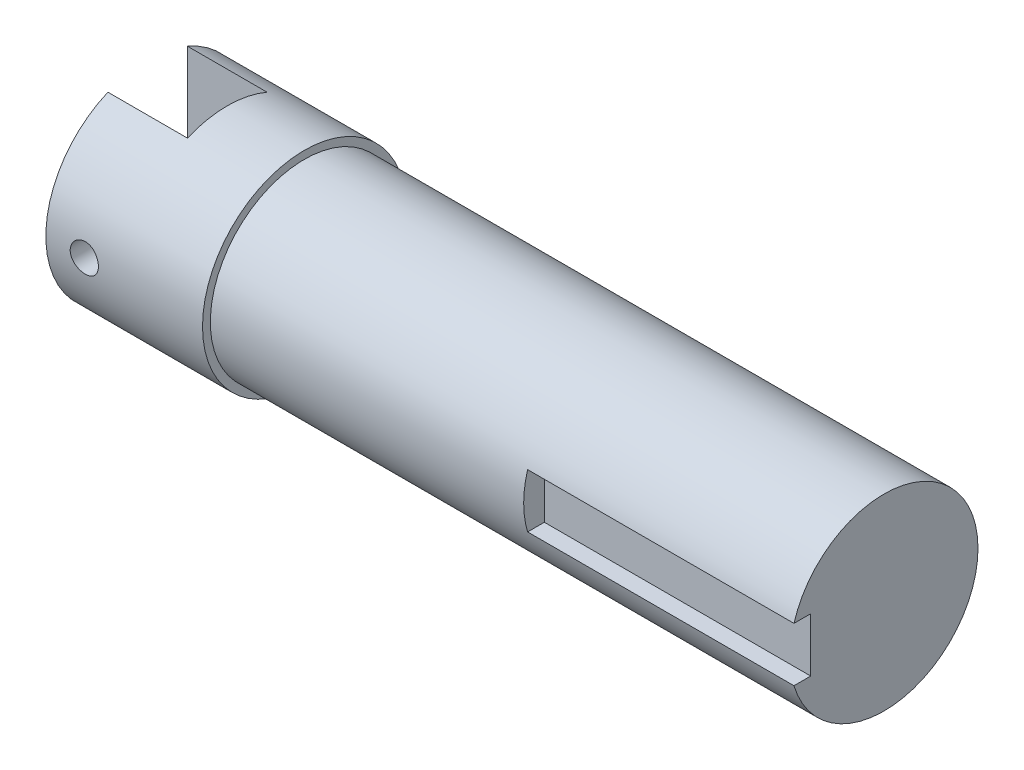
ISO-10303-21;
HEADER;
FILE_DESCRIPTION(('STEP AP214'),'2;1');
FILE_NAME('part.step','',(''),(''),'','','');
FILE_SCHEMA(('AUTOMOTIVE_DESIGN { 1 0 10303 214 1 1 1 1 }'));
ENDSEC;
DATA;
#1=APPLICATION_CONTEXT('core data for automotive mechanical design processes');
#2=APPLICATION_PROTOCOL_DEFINITION('international standard','automotive_design',2000,#1);
#3=PRODUCT_CONTEXT('',#1,'mechanical');
#4=PRODUCT('Part','Part','',(#3));
#5=PRODUCT_RELATED_PRODUCT_CATEGORY('part','',(#4));
#6=PRODUCT_DEFINITION_FORMATION('','',#4);
#7=PRODUCT_DEFINITION_CONTEXT('part definition',#1,'design');
#8=PRODUCT_DEFINITION('design','',#6,#7);
#9=PRODUCT_DEFINITION_SHAPE('','',#8);
#10=(LENGTH_UNIT() NAMED_UNIT(*) SI_UNIT(.MILLI.,.METRE.));
#11=(NAMED_UNIT(*) PLANE_ANGLE_UNIT() SI_UNIT($,.RADIAN.));
#12=(NAMED_UNIT(*) SI_UNIT($,.STERADIAN.) SOLID_ANGLE_UNIT());
#13=UNCERTAINTY_MEASURE_WITH_UNIT(LENGTH_MEASURE(1.E-05),#10,'distance_accuracy_value','');
#14=(GEOMETRIC_REPRESENTATION_CONTEXT(3) GLOBAL_UNCERTAINTY_ASSIGNED_CONTEXT((#13)) GLOBAL_UNIT_ASSIGNED_CONTEXT((#10,
#11,#12)) REPRESENTATION_CONTEXT('',''));
#15=CARTESIAN_POINT('',(0.,0.,0.));
#16=DIRECTION('',(0.,0.,1.));
#17=DIRECTION('',(1.,0.,0.));
#18=AXIS2_PLACEMENT_3D('',#15,#16,#17);
#19=CARTESIAN_POINT('',(-50.,0.,0.));
#20=DIRECTION('',(1.,0.,0.));
#21=DIRECTION('',(0.,0.,-1.));
#22=AXIS2_PLACEMENT_3D('',#19,#20,#21);
#23=CYLINDRICAL_SURFACE('',#22,32.5);
#24=CARTESIAN_POINT('',(0.,0.,0.));
#25=DIRECTION('',(-1.,0.,0.));
#26=DIRECTION('',(0.,0.,1.));
#27=AXIS2_PLACEMENT_3D('',#24,#25,#26);
#28=CIRCLE('',#27,32.5);
#29=CARTESIAN_POINT('',(0.,0.,32.5));
#30=VERTEX_POINT('',#29);
#31=EDGE_CURVE('E133',#30,#30,#28,.T.);
#32=ORIENTED_EDGE('',*,*,#31,.T.);
#33=EDGE_LOOP('',(#32));
#34=FACE_BOUND('',#33,.T.);
#35=DIRECTION('',(1.,0.,0.));
#36=VECTOR('',#35,1.);
#37=CARTESIAN_POINT('',(-50.,29.915882069563,12.7));
#38=LINE('',#37,#36);
#39=CARTESIAN_POINT('',(-50.,29.915882069563,12.7));
#40=VERTEX_POINT('',#39);
#41=CARTESIAN_POINT('',(-24.6,29.915882069563,12.7));
#42=VERTEX_POINT('',#41);
#43=EDGE_CURVE('E155',#40,#42,#38,.T.);
#44=ORIENTED_EDGE('',*,*,#43,.F.);
#45=CARTESIAN_POINT('',(-50.,0.,0.));
#46=DIRECTION('',(-1.,0.,0.));
#47=DIRECTION('',(0.,0.,1.));
#48=AXIS2_PLACEMENT_3D('',#45,#46,#47);
#49=CIRCLE('',#48,32.5);
#50=CARTESIAN_POINT('',(-50.,-29.915882069563,12.7));
#51=VERTEX_POINT('',#50);
#52=EDGE_CURVE('E127',#51,#40,#49,.T.);
#53=ORIENTED_EDGE('',*,*,#52,.F.);
#54=DIRECTION('',(1.,0.,0.));
#55=VECTOR('',#54,1.);
#56=CARTESIAN_POINT('',(-50.,-29.915882069563,12.7));
#57=LINE('',#56,#55);
#58=CARTESIAN_POINT('',(-24.6,-29.915882069563,12.7));
#59=VERTEX_POINT('',#58);
#60=EDGE_CURVE('E154',#59,#51,#57,.F.);
#61=ORIENTED_EDGE('',*,*,#60,.F.);
#62=CARTESIAN_POINT('',(-24.6,0.,0.));
#63=DIRECTION('',(-1.,0.,0.));
#64=DIRECTION('',(0.,0.,1.));
#65=AXIS2_PLACEMENT_3D('',#62,#63,#64);
#66=CIRCLE('',#65,32.5);
#67=CARTESIAN_POINT('',(-24.6,-29.915882069563,-12.7));
#68=VERTEX_POINT('',#67);
#69=EDGE_CURVE('E50',#68,#59,#66,.T.);
#70=ORIENTED_EDGE('',*,*,#69,.F.);
#71=DIRECTION('',(1.,0.,0.));
#72=VECTOR('',#71,1.);
#73=CARTESIAN_POINT('',(-50.,-29.915882069563,-12.7));
#74=LINE('',#73,#72);
#75=CARTESIAN_POINT('',(-50.,-29.915882069563,-12.7));
#76=VERTEX_POINT('',#75);
#77=EDGE_CURVE('E109',#68,#76,#74,.F.);
#78=ORIENTED_EDGE('',*,*,#77,.T.);
#79=CARTESIAN_POINT('',(-50.,29.915882069563,-12.7));
#80=VERTEX_POINT('',#79);
#81=EDGE_CURVE('E121',#80,#76,#49,.T.);
#82=ORIENTED_EDGE('',*,*,#81,.F.);
#83=DIRECTION('',(1.,0.,0.));
#84=VECTOR('',#83,1.);
#85=CARTESIAN_POINT('',(-50.,29.915882069563,-12.7));
#86=LINE('',#85,#84);
#87=CARTESIAN_POINT('',(-24.6,29.915882069563,-12.7));
#88=VERTEX_POINT('',#87);
#89=EDGE_CURVE('E57',#80,#88,#86,.T.);
#90=ORIENTED_EDGE('',*,*,#89,.T.);
#91=EDGE_CURVE('E11',#42,#88,#66,.T.);
#92=ORIENTED_EDGE('',*,*,#91,.F.);
#93=EDGE_LOOP('',(#44,#53,#61,#70,#78,#82,#90,#92));
#94=FACE_BOUND('',#93,.T.);
#95=CARTESIAN_POINT('',(-42.2297556983694,0.,32.5));
#96=CARTESIAN_POINT('',(-42.2297451677036,-0.251476713775578,32.4999961967984));
#97=CARTESIAN_POINT('',(-42.2086043939546,-0.50310478940474,32.4970505017367));
#98=CARTESIAN_POINT('',(-42.1246126299622,-0.999342758172016,32.4855829606299));
#99=CARTESIAN_POINT('',(-42.0617196039774,-1.2439453189056,32.4770554950366));
#100=CARTESIAN_POINT('',(-41.8961257537616,-1.71887765065578,32.4553838558711));
#101=CARTESIAN_POINT('',(-41.7934534322544,-1.94921750446027,32.4422429885323));
#102=CARTESIAN_POINT('',(-41.551281715441,-2.38935903564809,32.4128011760166));
#103=CARTESIAN_POINT('',(-41.4117880134298,-2.59916388127082,32.3965007194765));
#104=CARTESIAN_POINT('',(-41.0989361055868,-2.99372458135041,32.3624338055038));
#105=CARTESIAN_POINT('',(-40.9253801831463,-3.17832297301913,32.34465915659));
#106=CARTESIAN_POINT('',(-40.5497555990823,-3.51587326350804,32.3097122100158));
#107=CARTESIAN_POINT('',(-40.3476853918274,-3.66882344571174,32.2925399450709));
#108=CARTESIAN_POINT('',(-39.9197263672851,-3.9393363293882,32.2606621888148));
#109=CARTESIAN_POINT('',(-39.6937418159321,-4.05674893091849,32.2459672736233));
#110=CARTESIAN_POINT('',(-39.2250236093747,-4.25189485531683,32.2208182714461));
#111=CARTESIAN_POINT('',(-38.9822907321945,-4.32963001994773,32.2103639876219));
#112=CARTESIAN_POINT('',(-38.4886125042317,-4.44273029607437,32.1949595049808));
#113=CARTESIAN_POINT('',(-38.2377296385564,-4.47836332950903,32.1899745163225));
#114=CARTESIAN_POINT('',(-37.7334994758609,-4.5070773930153,32.1859670703542));
#115=CARTESIAN_POINT('',(-37.4801523003613,-4.50016051080444,32.186944320506));
#116=CARTESIAN_POINT('',(-36.9800653733341,-4.44419050668617,32.1947191037414));
#117=CARTESIAN_POINT('',(-36.7332916745216,-4.39543419051841,32.2014756379387));
#118=CARTESIAN_POINT('',(-36.2514622501809,-4.25763321097773,32.2199837109791));
#119=CARTESIAN_POINT('',(-36.0164068111022,-4.16858756327952,32.2317353718596));
#120=CARTESIAN_POINT('',(-35.5637740311881,-3.95242192943067,32.258955464481));
#121=CARTESIAN_POINT('',(-35.3462582569872,-3.82517465201875,32.274436287503));
#122=CARTESIAN_POINT('',(-34.9355545139508,-3.53630868635925,32.3073611719864));
#123=CARTESIAN_POINT('',(-34.7423679093103,-3.37468807208104,32.3248053434336));
#124=CARTESIAN_POINT('',(-34.3840849204299,-3.02002643822979,32.3598731155141));
#125=CARTESIAN_POINT('',(-34.2192413761775,-2.82672991685896,32.377496980523));
#126=CARTESIAN_POINT('',(-33.9242981803474,-2.41507855285903,32.4108001416562));
#127=CARTESIAN_POINT('',(-33.7941986430385,-2.19672362781936,32.4264794313849));
#128=CARTESIAN_POINT('',(-33.5724297309782,-1.7409462909971,32.454139828637));
#129=CARTESIAN_POINT('',(-33.4807780842477,-1.50351514330564,32.4661192295007));
#130=CARTESIAN_POINT('',(-33.3387171528008,-1.01642945157678,32.4850153198952));
#131=CARTESIAN_POINT('',(-33.2883054956737,-0.766775611549387,32.4919323006493));
#132=CARTESIAN_POINT('',(-33.2304876344266,-0.264515392173606,32.4998859786858));
#133=CARTESIAN_POINT('',(-33.2227334939367,-0.0119497903126556,32.5009702489016));
#134=CARTESIAN_POINT('',(-33.2495298205025,0.490877663116604,32.4972653278649));
#135=CARTESIAN_POINT('',(-33.2840791766062,0.741139575009299,32.492476290854));
#136=CARTESIAN_POINT('',(-33.3942125537434,1.23121489955244,32.4775923445856));
#137=CARTESIAN_POINT('',(-33.4696288059083,1.47106672978644,32.4675191335522));
#138=CARTESIAN_POINT('',(-33.6591794744278,1.9347203432569,32.4431934987228));
#139=CARTESIAN_POINT('',(-33.7733154709711,2.15852147099768,32.4289409043654));
#140=CARTESIAN_POINT('',(-34.0378943302182,2.58526237363048,32.3977242682124));
#141=CARTESIAN_POINT('',(-34.1885600150641,2.78806277681038,32.3807438102731));
#142=CARTESIAN_POINT('',(-34.5216087771067,3.16562300652935,32.3460174684232));
#143=CARTESIAN_POINT('',(-34.7039934123805,3.34038145479911,32.3282715469443));
#144=CARTESIAN_POINT('',(-35.0968440652709,3.6581478575641,32.2938654474841));
#145=CARTESIAN_POINT('',(-35.3074986019274,3.80092380777263,32.2772137856068));
#146=CARTESIAN_POINT('',(-35.7500037230946,4.04906448092933,32.2470272710179));
#147=CARTESIAN_POINT('',(-35.981853803799,4.15443009281,32.2334923442501));
#148=CARTESIAN_POINT('',(-36.4594494351649,4.32439176902625,32.2111317882919));
#149=CARTESIAN_POINT('',(-36.7051493298058,4.38911412693432,32.2022915842129));
#150=CARTESIAN_POINT('',(-37.2040616468359,4.47635645326582,32.1902812136673));
#151=CARTESIAN_POINT('',(-37.4572736323055,4.49887887126019,32.1871107180928));
#152=CARTESIAN_POINT('',(-37.9617121732623,4.50103014338553,32.1868097608989));
#153=CARTESIAN_POINT('',(-38.2129372200853,4.48102361290709,32.189627956089));
#154=CARTESIAN_POINT('',(-38.7084151715534,4.39946178518042,32.2008758407262));
#155=CARTESIAN_POINT('',(-38.9526680811706,4.33790651756229,32.2093055261716));
#156=CARTESIAN_POINT('',(-39.4271927753685,4.17511639123033,32.2308096274505));
#157=CARTESIAN_POINT('',(-39.6574721228238,4.07390322170887,32.2438815040708));
#158=CARTESIAN_POINT('',(-40.0978390927872,3.83470625888075,32.2732007003367));
#159=CARTESIAN_POINT('',(-40.3079262376124,3.69672159596941,32.2894480950772));
#160=CARTESIAN_POINT('',(-40.703803558774,3.38655978128656,32.323454064158));
#161=CARTESIAN_POINT('',(-40.8893804723867,3.21411164277081,32.3412239332684));
#162=CARTESIAN_POINT('',(-41.2290957062609,2.84048892484938,32.3761756740433));
#163=CARTESIAN_POINT('',(-41.3832266632331,2.63930763608215,32.3933574072095));
#164=CARTESIAN_POINT('',(-41.6563042237974,2.21283684805816,32.4252872449895));
#165=CARTESIAN_POINT('',(-41.7750834277696,1.98743931655715,32.4400236291611));
#166=CARTESIAN_POINT('',(-41.9729275895558,1.51980664796643,32.4652860630007));
#167=CARTESIAN_POINT('',(-42.0520346619281,1.27758967821949,32.4758165750478));
#168=CARTESIAN_POINT('',(-42.1498611194011,0.861835746844076,32.489011430211));
#169=CARTESIAN_POINT('',(-42.1797771351664,0.690893363532976,32.4931115113834));
#170=CARTESIAN_POINT('',(-42.2197279568701,0.346657949921302,32.4986070939359));
#171=CARTESIAN_POINT('',(-42.2297629580804,0.173364942725462,32.5000026218803));
#172=CARTESIAN_POINT('',(-42.2297556983694,0.,32.5));
#173=B_SPLINE_CURVE_WITH_KNOTS('',3,(#95,#96,#97,#98,#99,#100,#101,#102,#103,#104,#105,#106,
#107,#108,#109,#110,#111,#112,#113,#114,#115,#116,#117,#118,#119,#120,#121,#122,#123,#124,#125,
#126,#127,#128,#129,#130,#131,#132,#133,#134,#135,#136,#137,#138,#139,#140,#141,#142,#143,#144,
#145,#146,#147,#148,#149,#150,#151,#152,#153,#154,#155,#156,#157,#158,#159,#160,#161,#162,#163,
#164,#165,#166,#167,#168,#169,#170,#171,#172),.UNSPECIFIED.,.T.,.F.,(4,2,2,2,2,2,2,2,2,2,2,2,2,
2,2,2,2,2,2,2,2,2,2,2,2,2,2,2,2,2,2,2,2,2,2,2,2,2,4),(0.,0.753796769010256,1.50835360619536,
2.2623707840264,3.01627144448885,3.77468500241174,4.53313968633046,5.29475453026309,
6.05633401804302,6.81304054510393,7.5697099445499,8.32105554826591,9.0724195094075,
9.82631540716196,10.5802535588686,11.3406029574705,12.1009548567352,12.8616569639685,
13.6223153072524,14.3767600322741,15.1311849448957,15.8825359613667,16.6339176448591,
17.3900032766185,18.1461260588065,18.9075679559686,19.6689917587806,20.4280376745418,
21.1870395287609,21.9395604543382,22.6920808432625,23.4441902465277,24.1963174379175,
24.9546093969473,25.7130787120364,26.4750844303599,27.2362795084214,27.7559428017142,
28.2756009908328),.UNSPECIFIED.);
#174=CARTESIAN_POINT('',(-42.2297556983694,0.,32.5));
#175=VERTEX_POINT('',#174);
#176=EDGE_CURVE('E224',#175,#175,#173,.T.);
#177=ORIENTED_EDGE('',*,*,#176,.F.);
#178=EDGE_LOOP('',(#177));
#179=FACE_BOUND('',#178,.T.);
#180=CARTESIAN_POINT('',(-42.2297556983694,0.,-32.5));
#181=CARTESIAN_POINT('',(-42.2297451677036,0.251476713775578,-32.4999961967984));
#182=CARTESIAN_POINT('',(-42.2086043939546,0.50310478940474,-32.4970505017367));
#183=CARTESIAN_POINT('',(-42.1246126299622,0.999342758172016,-32.4855829606299));
#184=CARTESIAN_POINT('',(-42.0617196039774,1.2439453189056,-32.4770554950366));
#185=CARTESIAN_POINT('',(-41.8961257537616,1.71887765065578,-32.4553838558711));
#186=CARTESIAN_POINT('',(-41.7934534322544,1.94921750446027,-32.4422429885323));
#187=CARTESIAN_POINT('',(-41.551281715441,2.38935903564809,-32.4128011760166));
#188=CARTESIAN_POINT('',(-41.4117880134298,2.59916388127082,-32.3965007194765));
#189=CARTESIAN_POINT('',(-41.0989361055868,2.99372458135041,-32.3624338055038));
#190=CARTESIAN_POINT('',(-40.9253801831463,3.17832297301913,-32.34465915659));
#191=CARTESIAN_POINT('',(-40.5497555990823,3.51587326350804,-32.3097122100158));
#192=CARTESIAN_POINT('',(-40.3476853918274,3.66882344571174,-32.2925399450709));
#193=CARTESIAN_POINT('',(-39.9197263672851,3.9393363293882,-32.2606621888148));
#194=CARTESIAN_POINT('',(-39.6937418159321,4.05674893091849,-32.2459672736233));
#195=CARTESIAN_POINT('',(-39.2250236093747,4.25189485531683,-32.2208182714461));
#196=CARTESIAN_POINT('',(-38.9822907321945,4.32963001994773,-32.2103639876219));
#197=CARTESIAN_POINT('',(-38.4886125042317,4.44273029607437,-32.1949595049808));
#198=CARTESIAN_POINT('',(-38.2377296385564,4.47836332950903,-32.1899745163225));
#199=CARTESIAN_POINT('',(-37.7334994758609,4.5070773930153,-32.1859670703542));
#200=CARTESIAN_POINT('',(-37.4801523003613,4.50016051080444,-32.186944320506));
#201=CARTESIAN_POINT('',(-36.9800653733341,4.44419050668617,-32.1947191037414));
#202=CARTESIAN_POINT('',(-36.7332916745216,4.39543419051841,-32.2014756379387));
#203=CARTESIAN_POINT('',(-36.2514622501809,4.25763321097773,-32.2199837109791));
#204=CARTESIAN_POINT('',(-36.0164068111022,4.16858756327952,-32.2317353718596));
#205=CARTESIAN_POINT('',(-35.5637740311881,3.95242192943067,-32.258955464481));
#206=CARTESIAN_POINT('',(-35.3462582569872,3.82517465201875,-32.274436287503));
#207=CARTESIAN_POINT('',(-34.9355545139508,3.53630868635925,-32.3073611719864));
#208=CARTESIAN_POINT('',(-34.7423679093103,3.37468807208104,-32.3248053434336));
#209=CARTESIAN_POINT('',(-34.3840849204299,3.02002643822979,-32.3598731155141));
#210=CARTESIAN_POINT('',(-34.2192413761775,2.82672991685896,-32.377496980523));
#211=CARTESIAN_POINT('',(-33.9242981803474,2.41507855285903,-32.4108001416562));
#212=CARTESIAN_POINT('',(-33.7941986430385,2.19672362781936,-32.4264794313849));
#213=CARTESIAN_POINT('',(-33.5724297309782,1.7409462909971,-32.454139828637));
#214=CARTESIAN_POINT('',(-33.4807780842477,1.50351514330564,-32.4661192295007));
#215=CARTESIAN_POINT('',(-33.3387171528008,1.01642945157678,-32.4850153198952));
#216=CARTESIAN_POINT('',(-33.2883054956737,0.766775611549387,-32.4919323006493));
#217=CARTESIAN_POINT('',(-33.2304876344266,0.264515392173606,-32.4998859786858));
#218=CARTESIAN_POINT('',(-33.2227334939367,0.0119497903126556,-32.5009702489016));
#219=CARTESIAN_POINT('',(-33.2495298205025,-0.490877663116604,-32.4972653278649));
#220=CARTESIAN_POINT('',(-33.2840791766062,-0.741139575009299,-32.492476290854));
#221=CARTESIAN_POINT('',(-33.3942125537434,-1.23121489955244,-32.4775923445856));
#222=CARTESIAN_POINT('',(-33.4696288059083,-1.47106672978644,-32.4675191335522));
#223=CARTESIAN_POINT('',(-33.6591794744278,-1.9347203432569,-32.4431934987228));
#224=CARTESIAN_POINT('',(-33.7733154709711,-2.15852147099768,-32.4289409043654));
#225=CARTESIAN_POINT('',(-34.0378943302182,-2.58526237363048,-32.3977242682124));
#226=CARTESIAN_POINT('',(-34.1885600150641,-2.78806277681038,-32.3807438102731));
#227=CARTESIAN_POINT('',(-34.5216087771067,-3.16562300652935,-32.3460174684232));
#228=CARTESIAN_POINT('',(-34.7039934123805,-3.34038145479911,-32.3282715469443));
#229=CARTESIAN_POINT('',(-35.0968440652709,-3.6581478575641,-32.2938654474841));
#230=CARTESIAN_POINT('',(-35.3074986019274,-3.80092380777263,-32.2772137856068));
#231=CARTESIAN_POINT('',(-35.7500037230946,-4.04906448092933,-32.2470272710179));
#232=CARTESIAN_POINT('',(-35.981853803799,-4.15443009281,-32.2334923442501));
#233=CARTESIAN_POINT('',(-36.4594494351649,-4.32439176902625,-32.2111317882919));
#234=CARTESIAN_POINT('',(-36.7051493298058,-4.38911412693432,-32.2022915842129));
#235=CARTESIAN_POINT('',(-37.2040616468359,-4.47635645326582,-32.1902812136673));
#236=CARTESIAN_POINT('',(-37.4572736323055,-4.49887887126019,-32.1871107180928));
#237=CARTESIAN_POINT('',(-37.9617121732623,-4.50103014338553,-32.1868097608989));
#238=CARTESIAN_POINT('',(-38.2129372200853,-4.48102361290709,-32.189627956089));
#239=CARTESIAN_POINT('',(-38.7084151715534,-4.39946178518042,-32.2008758407262));
#240=CARTESIAN_POINT('',(-38.9526680811706,-4.33790651756229,-32.2093055261716));
#241=CARTESIAN_POINT('',(-39.4271927753685,-4.17511639123033,-32.2308096274505));
#242=CARTESIAN_POINT('',(-39.6574721228238,-4.07390322170887,-32.2438815040708));
#243=CARTESIAN_POINT('',(-40.0978390927872,-3.83470625888075,-32.2732007003367));
#244=CARTESIAN_POINT('',(-40.3079262376124,-3.69672159596941,-32.2894480950772));
#245=CARTESIAN_POINT('',(-40.703803558774,-3.38655978128656,-32.323454064158));
#246=CARTESIAN_POINT('',(-40.8893804723867,-3.21411164277081,-32.3412239332684));
#247=CARTESIAN_POINT('',(-41.2290957062609,-2.84048892484938,-32.3761756740433));
#248=CARTESIAN_POINT('',(-41.3832266632331,-2.63930763608215,-32.3933574072095));
#249=CARTESIAN_POINT('',(-41.6563042237974,-2.21283684805816,-32.4252872449895));
#250=CARTESIAN_POINT('',(-41.7750834277696,-1.98743931655715,-32.4400236291611));
#251=CARTESIAN_POINT('',(-41.9729275895558,-1.51980664796643,-32.4652860630007));
#252=CARTESIAN_POINT('',(-42.0520346619281,-1.27758967821949,-32.4758165750478));
#253=CARTESIAN_POINT('',(-42.1498611194011,-0.861835746844076,-32.489011430211));
#254=CARTESIAN_POINT('',(-42.1797771351664,-0.690893363532976,-32.4931115113834));
#255=CARTESIAN_POINT('',(-42.2197279568701,-0.346657949921302,-32.4986070939359));
#256=CARTESIAN_POINT('',(-42.2297629580804,-0.173364942725462,-32.5000026218803));
#257=CARTESIAN_POINT('',(-42.2297556983694,0.,-32.5));
#258=B_SPLINE_CURVE_WITH_KNOTS('',3,(#180,#181,#182,#183,#184,#185,#186,#187,#188,#189,#190,
#191,#192,#193,#194,#195,#196,#197,#198,#199,#200,#201,#202,#203,#204,#205,#206,#207,#208,#209,
#210,#211,#212,#213,#214,#215,#216,#217,#218,#219,#220,#221,#222,#223,#224,#225,#226,#227,#228,
#229,#230,#231,#232,#233,#234,#235,#236,#237,#238,#239,#240,#241,#242,#243,#244,#245,#246,#247,
#248,#249,#250,#251,#252,#253,#254,#255,#256,#257),.UNSPECIFIED.,.T.,.F.,(4,2,2,2,2,2,2,2,2,2,2,
2,2,2,2,2,2,2,2,2,2,2,2,2,2,2,2,2,2,2,2,2,2,2,2,2,2,2,4),(0.,0.753796769010256,1.50835360619536,
2.2623707840264,3.01627144448885,3.77468500241174,4.53313968633046,5.29475453026309,
6.05633401804302,6.81304054510393,7.5697099445499,8.32105554826591,9.0724195094075,
9.82631540716196,10.5802535588686,11.3406029574705,12.1009548567352,12.8616569639685,
13.6223153072524,14.3767600322741,15.1311849448957,15.8825359613667,16.6339176448591,
17.3900032766185,18.1461260588065,18.9075679559686,19.6689917587806,20.4280376745418,
21.1870395287609,21.9395604543382,22.6920808432625,23.4441902465277,24.1963174379175,
24.9546093969473,25.7130787120364,26.4750844303599,27.2362795084214,27.7559428017142,
28.2756009908328),.UNSPECIFIED.);
#259=CARTESIAN_POINT('',(-42.2297556983694,0.,-32.5));
#260=VERTEX_POINT('',#259);
#261=EDGE_CURVE('E231',#260,#260,#258,.T.);
#262=ORIENTED_EDGE('',*,*,#261,.F.);
#263=EDGE_LOOP('',(#262));
#264=FACE_BOUND('',#263,.T.);
#265=ADVANCED_FACE('F41',(#34,#94,#179,#264),#23,.T.);
#266=CARTESIAN_POINT('',(-50.,0.,0.));
#267=DIRECTION('',(-1.,0.,0.));
#268=DIRECTION('',(0.,0.,1.));
#269=AXIS2_PLACEMENT_3D('',#266,#267,#268);
#270=PLANE('',#269);
#271=ORIENTED_EDGE('',*,*,#52,.T.);
#272=DIRECTION('',(0.,-1.,0.));
#273=VECTOR('',#272,1.);
#274=CARTESIAN_POINT('',(-50.,0.,12.7));
#275=LINE('',#274,#273);
#276=EDGE_CURVE('E114',#40,#51,#275,.T.);
#277=ORIENTED_EDGE('',*,*,#276,.T.);
#278=EDGE_LOOP('',(#271,#277));
#279=FACE_BOUND('',#278,.T.);
#280=ADVANCED_FACE('F211',(#279),#270,.T.);
#281=CARTESIAN_POINT('',(185.,0.,0.));
#282=DIRECTION('',(-1.,0.,0.));
#283=DIRECTION('',(0.,0.,1.));
#284=AXIS2_PLACEMENT_3D('',#281,#282,#283);
#285=CYLINDRICAL_SURFACE('',#284,30.);
#286=CARTESIAN_POINT('',(185.,0.,0.));
#287=DIRECTION('',(1.,0.,0.));
#288=DIRECTION('',(0.,0.,-1.));
#289=AXIS2_PLACEMENT_3D('',#286,#287,#288);
#290=CIRCLE('',#289,30.);
#291=CARTESIAN_POINT('',(185.,-8.6135173493858,28.7368634139468));
#292=VERTEX_POINT('',#291);
#293=CARTESIAN_POINT('',(185.,8.61351734938581,28.7368634139468));
#294=VERTEX_POINT('',#293);
#295=EDGE_CURVE('E130',#292,#294,#290,.T.);
#296=ORIENTED_EDGE('',*,*,#295,.F.);
#297=DIRECTION('',(-1.,0.,0.));
#298=VECTOR('',#297,1.);
#299=CARTESIAN_POINT('',(185.,-8.6135173493858,28.7368634139468));
#300=LINE('',#299,#298);
#301=CARTESIAN_POINT('',(100.,-8.6135173493858,28.7368634139468));
#302=VERTEX_POINT('',#301);
#303=EDGE_CURVE('E136',#292,#302,#300,.T.);
#304=ORIENTED_EDGE('',*,*,#303,.T.);
#305=CARTESIAN_POINT('',(100.,0.,0.));
#306=DIRECTION('',(1.,0.,0.));
#307=DIRECTION('',(0.,0.,-1.));
#308=AXIS2_PLACEMENT_3D('',#305,#306,#307);
#309=CIRCLE('',#308,30.);
#310=CARTESIAN_POINT('',(100.,8.6135173493858,28.7368634139468));
#311=VERTEX_POINT('',#310);
#312=EDGE_CURVE('E115',#311,#302,#309,.T.);
#313=ORIENTED_EDGE('',*,*,#312,.F.);
#314=DIRECTION('',(-1.,0.,0.));
#315=VECTOR('',#314,1.);
#316=CARTESIAN_POINT('',(185.,8.6135173493858,28.7368634139468));
#317=LINE('',#316,#315);
#318=EDGE_CURVE('E176',#311,#294,#317,.F.);
#319=ORIENTED_EDGE('',*,*,#318,.T.);
#320=EDGE_LOOP('',(#296,#304,#313,#319));
#321=FACE_BOUND('',#320,.T.);
#322=CARTESIAN_POINT('',(0.,0.,0.));
#323=DIRECTION('',(1.,0.,0.));
#324=DIRECTION('',(0.,0.,-1.));
#325=AXIS2_PLACEMENT_3D('',#322,#323,#324);
#326=CIRCLE('',#325,30.);
#327=CARTESIAN_POINT('',(0.,0.,-30.));
#328=VERTEX_POINT('',#327);
#329=EDGE_CURVE('E126',#328,#328,#326,.T.);
#330=ORIENTED_EDGE('',*,*,#329,.T.);
#331=EDGE_LOOP('',(#330));
#332=FACE_BOUND('',#331,.T.);
#333=ADVANCED_FACE('F43',(#321,#332),#285,.T.);
#334=CARTESIAN_POINT('',(185.,0.,0.));
#335=DIRECTION('',(1.,0.,0.));
#336=DIRECTION('',(0.,0.,-1.));
#337=AXIS2_PLACEMENT_3D('',#334,#335,#336);
#338=PLANE('',#337);
#339=DIRECTION('',(0.,0.,-1.));
#340=VECTOR('',#339,1.);
#341=CARTESIAN_POINT('',(185.,-8.61351734938583,0.));
#342=LINE('',#341,#340);
#343=CARTESIAN_POINT('',(185.,-8.61351734938581,23.4));
#344=VERTEX_POINT('',#343);
#345=EDGE_CURVE('E141',#292,#344,#342,.T.);
#346=ORIENTED_EDGE('',*,*,#345,.F.);
#347=ORIENTED_EDGE('',*,*,#295,.T.);
#348=DIRECTION('',(0.,0.,1.));
#349=VECTOR('',#348,1.);
#350=CARTESIAN_POINT('',(185.,8.6135173493858,34.4));
#351=LINE('',#350,#349);
#352=CARTESIAN_POINT('',(185.,8.61351734938581,23.4));
#353=VERTEX_POINT('',#352);
#354=EDGE_CURVE('E166',#353,#294,#351,.T.);
#355=ORIENTED_EDGE('',*,*,#354,.F.);
#356=DIRECTION('',(0.,1.,0.));
#357=VECTOR('',#356,1.);
#358=CARTESIAN_POINT('',(185.,-8.61351734938581,23.4));
#359=LINE('',#358,#357);
#360=EDGE_CURVE('E159',#344,#353,#359,.T.);
#361=ORIENTED_EDGE('',*,*,#360,.F.);
#362=EDGE_LOOP('',(#346,#347,#355,#361));
#363=FACE_BOUND('',#362,.T.);
#364=ADVANCED_FACE('F189',(#363),#338,.T.);
#365=DIRECTION('',(0.,-1.,0.));
#366=VECTOR('',#365,1.);
#367=CARTESIAN_POINT('',(-50.,0.,-12.7));
#368=LINE('',#367,#366);
#369=EDGE_CURVE('E106',#80,#76,#368,.T.);
#370=ORIENTED_EDGE('',*,*,#369,.F.);
#371=ORIENTED_EDGE('',*,*,#81,.T.);
#372=EDGE_LOOP('',(#370,#371));
#373=FACE_BOUND('',#372,.T.);
#374=ADVANCED_FACE('F125',(#373),#270,.T.);
#375=CARTESIAN_POINT('',(0.,0.,0.));
#376=DIRECTION('',(-1.,0.,0.));
#377=DIRECTION('',(0.,0.,1.));
#378=AXIS2_PLACEMENT_3D('',#375,#376,#377);
#379=PLANE('',#378);
#380=ORIENTED_EDGE('',*,*,#329,.F.);
#381=EDGE_LOOP('',(#380));
#382=FACE_BOUND('',#381,.T.);
#383=ORIENTED_EDGE('',*,*,#31,.F.);
#384=EDGE_LOOP('',(#383));
#385=FACE_BOUND('',#384,.T.);
#386=ADVANCED_FACE('F198',(#382,#385),#379,.F.);
#387=CARTESIAN_POINT('',(100.,0.,0.));
#388=DIRECTION('',(1.,0.,0.));
#389=DIRECTION('',(0.,0.,-1.));
#390=AXIS2_PLACEMENT_3D('',#387,#388,#389);
#391=PLANE('',#390);
#392=ORIENTED_EDGE('',*,*,#312,.T.);
#393=DIRECTION('',(0.,0.,-1.));
#394=VECTOR('',#393,1.);
#395=CARTESIAN_POINT('',(100.,-8.61351734938579,34.4));
#396=LINE('',#395,#394);
#397=CARTESIAN_POINT('',(100.,-8.61351734938581,23.4));
#398=VERTEX_POINT('',#397);
#399=EDGE_CURVE('E163',#302,#398,#396,.T.);
#400=ORIENTED_EDGE('',*,*,#399,.T.);
#401=DIRECTION('',(0.,1.,0.));
#402=VECTOR('',#401,1.);
#403=CARTESIAN_POINT('',(100.,-8.61351734938581,23.4));
#404=LINE('',#403,#402);
#405=CARTESIAN_POINT('',(100.,8.61351734938581,23.4));
#406=VERTEX_POINT('',#405);
#407=EDGE_CURVE('E165',#398,#406,#404,.T.);
#408=ORIENTED_EDGE('',*,*,#407,.T.);
#409=DIRECTION('',(0.,0.,1.));
#410=VECTOR('',#409,1.);
#411=CARTESIAN_POINT('',(100.,8.6135173493858,34.4));
#412=LINE('',#411,#410);
#413=EDGE_CURVE('E169',#406,#311,#412,.T.);
#414=ORIENTED_EDGE('',*,*,#413,.T.);
#415=EDGE_LOOP('',(#392,#400,#408,#414));
#416=FACE_BOUND('',#415,.T.);
#417=ADVANCED_FACE('F196',(#416),#391,.T.);
#418=CARTESIAN_POINT('',(100.,-8.61351734938579,34.4));
#419=DIRECTION('',(0.,-1.,0.));
#420=DIRECTION('',(0.,0.,-1.));
#421=AXIS2_PLACEMENT_3D('',#418,#419,#420);
#422=PLANE('',#421);
#423=ORIENTED_EDGE('',*,*,#345,.T.);
#424=DIRECTION('',(1.,0.,0.));
#425=VECTOR('',#424,1.);
#426=CARTESIAN_POINT('',(100.,-8.61351734938581,23.4));
#427=LINE('',#426,#425);
#428=EDGE_CURVE('E65',#398,#344,#427,.T.);
#429=ORIENTED_EDGE('',*,*,#428,.F.);
#430=ORIENTED_EDGE('',*,*,#399,.F.);
#431=ORIENTED_EDGE('',*,*,#303,.F.);
#432=EDGE_LOOP('',(#423,#429,#430,#431));
#433=FACE_BOUND('',#432,.T.);
#434=ADVANCED_FACE('F186',(#433),#422,.F.);
#435=CARTESIAN_POINT('',(100.,8.6135173493858,34.4));
#436=DIRECTION('',(0.,1.,0.));
#437=DIRECTION('',(0.,0.,1.));
#438=AXIS2_PLACEMENT_3D('',#435,#436,#437);
#439=PLANE('',#438);
#440=ORIENTED_EDGE('',*,*,#413,.F.);
#441=DIRECTION('',(1.,0.,0.));
#442=VECTOR('',#441,1.);
#443=CARTESIAN_POINT('',(100.,8.61351734938581,23.4));
#444=LINE('',#443,#442);
#445=EDGE_CURVE('E174',#406,#353,#444,.T.);
#446=ORIENTED_EDGE('',*,*,#445,.T.);
#447=ORIENTED_EDGE('',*,*,#354,.T.);
#448=ORIENTED_EDGE('',*,*,#318,.F.);
#449=EDGE_LOOP('',(#440,#446,#447,#448));
#450=FACE_BOUND('',#449,.T.);
#451=ADVANCED_FACE('F194',(#450),#439,.F.);
#452=CARTESIAN_POINT('',(100.,-8.61351734938581,23.4));
#453=DIRECTION('',(0.,0.,-1.));
#454=DIRECTION('',(0.,1.,0.));
#455=AXIS2_PLACEMENT_3D('',#452,#453,#454);
#456=PLANE('',#455);
#457=ORIENTED_EDGE('',*,*,#360,.T.);
#458=ORIENTED_EDGE('',*,*,#445,.F.);
#459=ORIENTED_EDGE('',*,*,#407,.F.);
#460=ORIENTED_EDGE('',*,*,#428,.T.);
#461=EDGE_LOOP('',(#457,#458,#459,#460));
#462=FACE_BOUND('',#461,.T.);
#463=ADVANCED_FACE('F191',(#462),#456,.F.);
#464=CARTESIAN_POINT('',(-24.6,0.,0.));
#465=DIRECTION('',(-1.,0.,0.));
#466=DIRECTION('',(0.,0.,1.));
#467=AXIS2_PLACEMENT_3D('',#464,#465,#466);
#468=PLANE('',#467);
#469=ORIENTED_EDGE('',*,*,#91,.T.);
#470=DIRECTION('',(0.,-1.,0.));
#471=VECTOR('',#470,1.);
#472=CARTESIAN_POINT('',(-24.6,45.1644459567815,-12.7));
#473=LINE('',#472,#471);
#474=EDGE_CURVE('E151',#88,#68,#473,.T.);
#475=ORIENTED_EDGE('',*,*,#474,.T.);
#476=ORIENTED_EDGE('',*,*,#69,.T.);
#477=DIRECTION('',(0.,-1.,0.));
#478=VECTOR('',#477,1.);
#479=CARTESIAN_POINT('',(-24.6,45.1644459567815,12.7));
#480=LINE('',#479,#478);
#481=EDGE_CURVE('E123',#42,#59,#480,.T.);
#482=ORIENTED_EDGE('',*,*,#481,.F.);
#483=EDGE_LOOP('',(#469,#475,#476,#482));
#484=FACE_BOUND('',#483,.T.);
#485=ADVANCED_FACE('F149',(#484),#468,.T.);
#486=CARTESIAN_POINT('',(-24.6,45.1644459567815,12.7));
#487=DIRECTION('',(0.,0.,-1.));
#488=DIRECTION('',(-1.,0.,0.));
#489=AXIS2_PLACEMENT_3D('',#486,#487,#488);
#490=PLANE('',#489);
#491=CARTESIAN_POINT('',(-37.7297556983694,0.,12.7));
#492=DIRECTION('',(0.,0.,-1.));
#493=DIRECTION('',(-1.,0.,0.));
#494=AXIS2_PLACEMENT_3D('',#491,#492,#493);
#495=CIRCLE('',#494,4.5);
#496=CARTESIAN_POINT('',(-42.2297556983694,0.,12.7));
#497=VERTEX_POINT('',#496);
#498=EDGE_CURVE('E252',#497,#497,#495,.F.);
#499=ORIENTED_EDGE('',*,*,#498,.T.);
#500=EDGE_LOOP('',(#499));
#501=FACE_BOUND('',#500,.T.);
#502=ORIENTED_EDGE('',*,*,#43,.T.);
#503=ORIENTED_EDGE('',*,*,#481,.T.);
#504=ORIENTED_EDGE('',*,*,#60,.T.);
#505=ORIENTED_EDGE('',*,*,#276,.F.);
#506=EDGE_LOOP('',(#502,#503,#504,#505));
#507=FACE_BOUND('',#506,.T.);
#508=ADVANCED_FACE('F153',(#501,#507),#490,.T.);
#509=CARTESIAN_POINT('',(-24.6,45.1644459567815,-12.7));
#510=DIRECTION('',(0.,0.,-1.));
#511=DIRECTION('',(-1.,0.,0.));
#512=AXIS2_PLACEMENT_3D('',#509,#510,#511);
#513=PLANE('',#512);
#514=CARTESIAN_POINT('',(-37.7297556983694,0.,-12.7));
#515=DIRECTION('',(0.,0.,-1.));
#516=DIRECTION('',(-1.,0.,0.));
#517=AXIS2_PLACEMENT_3D('',#514,#515,#516);
#518=CIRCLE('',#517,4.5);
#519=CARTESIAN_POINT('',(-42.2297556983694,0.,-12.7));
#520=VERTEX_POINT('',#519);
#521=EDGE_CURVE('E45',#520,#520,#518,.F.);
#522=ORIENTED_EDGE('',*,*,#521,.F.);
#523=EDGE_LOOP('',(#522));
#524=FACE_BOUND('',#523,.T.);
#525=ORIENTED_EDGE('',*,*,#369,.T.);
#526=ORIENTED_EDGE('',*,*,#77,.F.);
#527=ORIENTED_EDGE('',*,*,#474,.F.);
#528=ORIENTED_EDGE('',*,*,#89,.F.);
#529=EDGE_LOOP('',(#525,#526,#527,#528));
#530=FACE_BOUND('',#529,.T.);
#531=ADVANCED_FACE('F108',(#524,#530),#513,.F.);
#532=CARTESIAN_POINT('',(-37.7297556983694,0.,53.7));
#533=DIRECTION('',(0.,0.,-1.));
#534=DIRECTION('',(-1.,0.,0.));
#535=AXIS2_PLACEMENT_3D('',#532,#533,#534);
#536=CYLINDRICAL_SURFACE('',#535,4.5);
#537=ORIENTED_EDGE('',*,*,#521,.T.);
#538=EDGE_LOOP('',(#537));
#539=FACE_BOUND('',#538,.T.);
#540=ORIENTED_EDGE('',*,*,#261,.T.);
#541=EDGE_LOOP('',(#540));
#542=FACE_BOUND('',#541,.T.);
#543=ADVANCED_FACE('F237',(#539,#542),#536,.F.);
#544=ORIENTED_EDGE('',*,*,#498,.F.);
#545=EDGE_LOOP('',(#544));
#546=FACE_BOUND('',#545,.T.);
#547=ORIENTED_EDGE('',*,*,#176,.T.);
#548=EDGE_LOOP('',(#547));
#549=FACE_BOUND('',#548,.T.);
#550=ADVANCED_FACE('F241',(#546,#549),#536,.F.);
#551=CLOSED_SHELL('',(#265,#280,#333,#364,#374,#386,#417,#434,#451,#463,#485,#508,#531,#543,#550));
#552=MANIFOLD_SOLID_BREP('B2',#551);
#553=ADVANCED_BREP_SHAPE_REPRESENTATION('',(#18,#552),#14);
#554=SHAPE_DEFINITION_REPRESENTATION(#9,#553);
ENDSEC;
END-ISO-10303-21;
